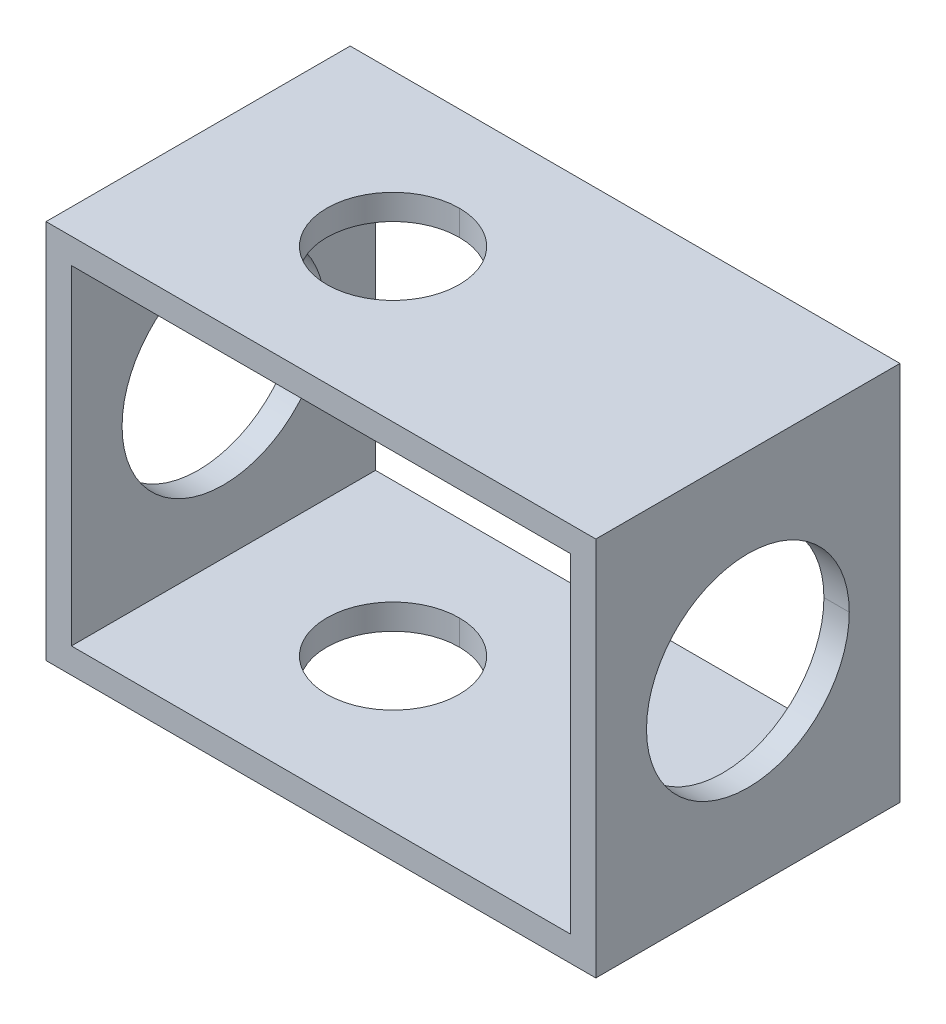
ISO-10303-21;
HEADER;
FILE_DESCRIPTION(('STEP AP214'),'2;1');
FILE_NAME('part.step','',(''),(''),'','','');
FILE_SCHEMA(('AUTOMOTIVE_DESIGN { 1 0 10303 214 1 1 1 1 }'));
ENDSEC;
DATA;
#1=APPLICATION_CONTEXT('core data for automotive mechanical design processes');
#2=APPLICATION_PROTOCOL_DEFINITION('international standard','automotive_design',2000,#1);
#3=PRODUCT_CONTEXT('',#1,'mechanical');
#4=PRODUCT('Part','Part','',(#3));
#5=PRODUCT_RELATED_PRODUCT_CATEGORY('part','',(#4));
#6=PRODUCT_DEFINITION_FORMATION('','',#4);
#7=PRODUCT_DEFINITION_CONTEXT('part definition',#1,'design');
#8=PRODUCT_DEFINITION('design','',#6,#7);
#9=PRODUCT_DEFINITION_SHAPE('','',#8);
#10=(LENGTH_UNIT() NAMED_UNIT(*) SI_UNIT(.MILLI.,.METRE.));
#11=(NAMED_UNIT(*) PLANE_ANGLE_UNIT() SI_UNIT($,.RADIAN.));
#12=(NAMED_UNIT(*) SI_UNIT($,.STERADIAN.) SOLID_ANGLE_UNIT());
#13=UNCERTAINTY_MEASURE_WITH_UNIT(LENGTH_MEASURE(1.E-05),#10,'distance_accuracy_value','');
#14=(GEOMETRIC_REPRESENTATION_CONTEXT(3) GLOBAL_UNCERTAINTY_ASSIGNED_CONTEXT((#13)) GLOBAL_UNIT_ASSIGNED_CONTEXT((#10,
#11,#12)) REPRESENTATION_CONTEXT('',''));
#15=CARTESIAN_POINT('',(0.,0.,0.));
#16=DIRECTION('',(0.,0.,1.));
#17=DIRECTION('',(1.,0.,0.));
#18=AXIS2_PLACEMENT_3D('',#15,#16,#17);
#19=CARTESIAN_POINT('',(-7.88522012578619,-18.75,15.));
#20=DIRECTION('',(0.,1.,0.));
#21=DIRECTION('',(0.,0.,1.));
#22=AXIS2_PLACEMENT_3D('',#19,#20,#21);
#23=CYLINDRICAL_SURFACE('',#22,6.53373114906941);
#24=CARTESIAN_POINT('',(-7.88522012578619,16.25,15.));
#25=DIRECTION('',(0.,-1.,0.));
#26=DIRECTION('',(0.,0.,-1.));
#27=AXIS2_PLACEMENT_3D('',#24,#25,#26);
#28=CIRCLE('',#27,6.53373114906941);
#29=CARTESIAN_POINT('',(-7.88522012578619,16.25,21.5337311490694));
#30=VERTEX_POINT('',#29);
#31=CARTESIAN_POINT('',(-7.88522012578619,16.25,8.46626885093059));
#32=VERTEX_POINT('',#31);
#33=EDGE_CURVE('E11',#30,#32,#28,.T.);
#34=ORIENTED_EDGE('',*,*,#33,.T.);
#35=DIRECTION('',(0.,1.,0.));
#36=VECTOR('',#35,1.);
#37=CARTESIAN_POINT('',(-7.88522012578619,-18.75,8.46626885093059));
#38=LINE('',#37,#36);
#39=CARTESIAN_POINT('',(-7.88522012578619,18.75,8.46626885093059));
#40=VERTEX_POINT('',#39);
#41=EDGE_CURVE('E27',#32,#40,#38,.T.);
#42=ORIENTED_EDGE('',*,*,#41,.T.);
#43=CARTESIAN_POINT('',(-7.88522012578619,18.75,15.));
#44=DIRECTION('',(0.,1.,0.));
#45=DIRECTION('',(0.,0.,1.));
#46=AXIS2_PLACEMENT_3D('',#43,#44,#45);
#47=CIRCLE('',#46,6.53373114906941);
#48=CARTESIAN_POINT('',(-7.88522012578619,18.75,21.5337311490694));
#49=VERTEX_POINT('',#48);
#50=EDGE_CURVE('E293',#40,#49,#47,.T.);
#51=ORIENTED_EDGE('',*,*,#50,.T.);
#52=DIRECTION('',(0.,1.,0.));
#53=VECTOR('',#52,1.);
#54=CARTESIAN_POINT('',(-7.88522012578619,-18.75,21.5337311490694));
#55=LINE('',#54,#53);
#56=EDGE_CURVE('E251',#30,#49,#55,.T.);
#57=ORIENTED_EDGE('',*,*,#56,.F.);
#58=EDGE_LOOP('',(#34,#42,#51,#57));
#59=FACE_BOUND('',#58,.T.);
#60=ADVANCED_FACE('F16',(#59),#23,.F.);
#61=CARTESIAN_POINT('',(-7.88522012578619,-18.75,15.));
#62=DIRECTION('',(0.,1.,0.));
#63=DIRECTION('',(0.,0.,1.));
#64=AXIS2_PLACEMENT_3D('',#61,#62,#63);
#65=CYLINDRICAL_SURFACE('',#64,6.53373114906941);
#66=CARTESIAN_POINT('',(-7.88522012578619,-18.75,15.));
#67=DIRECTION('',(0.,1.,0.));
#68=DIRECTION('',(0.,0.,1.));
#69=AXIS2_PLACEMENT_3D('',#66,#67,#68);
#70=CIRCLE('',#69,6.53373114906941);
#71=CARTESIAN_POINT('',(-7.88522012578619,-18.75,8.46626885093059));
#72=VERTEX_POINT('',#71);
#73=CARTESIAN_POINT('',(-7.88522012578619,-18.75,21.5337311490694));
#74=VERTEX_POINT('',#73);
#75=EDGE_CURVE('E150',#72,#74,#70,.T.);
#76=ORIENTED_EDGE('',*,*,#75,.F.);
#77=DIRECTION('',(0.,1.,0.));
#78=VECTOR('',#77,1.);
#79=CARTESIAN_POINT('',(-7.88522012578619,-18.75,8.46626885093059));
#80=LINE('',#79,#78);
#81=CARTESIAN_POINT('',(-7.88522012578619,-16.25,8.46626885093059));
#82=VERTEX_POINT('',#81);
#83=EDGE_CURVE('E168',#72,#82,#80,.T.);
#84=ORIENTED_EDGE('',*,*,#83,.T.);
#85=CARTESIAN_POINT('',(-7.88522012578619,-16.25,15.));
#86=DIRECTION('',(0.,1.,0.));
#87=DIRECTION('',(0.,0.,1.));
#88=AXIS2_PLACEMENT_3D('',#85,#86,#87);
#89=CIRCLE('',#88,6.53373114906941);
#90=CARTESIAN_POINT('',(-7.88522012578619,-16.25,21.5337311490694));
#91=VERTEX_POINT('',#90);
#92=EDGE_CURVE('E152',#82,#91,#89,.T.);
#93=ORIENTED_EDGE('',*,*,#92,.T.);
#94=DIRECTION('',(0.,1.,0.));
#95=VECTOR('',#94,1.);
#96=CARTESIAN_POINT('',(-7.88522012578619,-18.75,21.5337311490694));
#97=LINE('',#96,#95);
#98=EDGE_CURVE('E146',#74,#91,#97,.T.);
#99=ORIENTED_EDGE('',*,*,#98,.F.);
#100=EDGE_LOOP('',(#76,#84,#93,#99));
#101=FACE_BOUND('',#100,.T.);
#102=ADVANCED_FACE('F148',(#101),#65,.F.);
#103=CARTESIAN_POINT('',(27.1147798742138,0.,15.));
#104=DIRECTION('',(-1.,0.,0.));
#105=DIRECTION('',(0.,0.,1.));
#106=AXIS2_PLACEMENT_3D('',#103,#104,#105);
#107=CYLINDRICAL_SURFACE('',#106,10.);
#108=CARTESIAN_POINT('',(27.1147798742138,0.,15.));
#109=DIRECTION('',(-1.,0.,0.));
#110=DIRECTION('',(0.,0.,1.));
#111=AXIS2_PLACEMENT_3D('',#108,#109,#110);
#112=CIRCLE('',#111,10.);
#113=CARTESIAN_POINT('',(27.1147798742138,0.,5.));
#114=VERTEX_POINT('',#113);
#115=CARTESIAN_POINT('',(27.1147798742138,0.,25.));
#116=VERTEX_POINT('',#115);
#117=EDGE_CURVE('E202',#114,#116,#112,.T.);
#118=ORIENTED_EDGE('',*,*,#117,.F.);
#119=DIRECTION('',(-1.,0.,0.));
#120=VECTOR('',#119,1.);
#121=CARTESIAN_POINT('',(27.1147798742138,0.,5.));
#122=LINE('',#121,#120);
#123=CARTESIAN_POINT('',(24.6147798742138,0.,5.));
#124=VERTEX_POINT('',#123);
#125=EDGE_CURVE('E196',#114,#124,#122,.T.);
#126=ORIENTED_EDGE('',*,*,#125,.T.);
#127=CARTESIAN_POINT('',(24.6147798742138,0.,15.));
#128=DIRECTION('',(-1.,0.,0.));
#129=DIRECTION('',(0.,0.,1.));
#130=AXIS2_PLACEMENT_3D('',#127,#128,#129);
#131=CIRCLE('',#130,10.);
#132=CARTESIAN_POINT('',(24.6147798742138,0.,25.));
#133=VERTEX_POINT('',#132);
#134=EDGE_CURVE('E187',#124,#133,#131,.T.);
#135=ORIENTED_EDGE('',*,*,#134,.T.);
#136=DIRECTION('',(-1.,0.,0.));
#137=VECTOR('',#136,1.);
#138=CARTESIAN_POINT('',(27.1147798742138,0.,25.));
#139=LINE('',#138,#137);
#140=EDGE_CURVE('E20',#116,#133,#139,.T.);
#141=ORIENTED_EDGE('',*,*,#140,.F.);
#142=EDGE_LOOP('',(#118,#126,#135,#141));
#143=FACE_BOUND('',#142,.T.);
#144=ADVANCED_FACE('F371',(#143),#107,.F.);
#145=CARTESIAN_POINT('',(27.1147798742138,0.,15.));
#146=DIRECTION('',(-1.,0.,0.));
#147=DIRECTION('',(0.,0.,1.));
#148=AXIS2_PLACEMENT_3D('',#145,#146,#147);
#149=CYLINDRICAL_SURFACE('',#148,10.);
#150=CARTESIAN_POINT('',(-24.6147798742138,0.,15.));
#151=DIRECTION('',(1.,0.,0.));
#152=DIRECTION('',(0.,0.,-1.));
#153=AXIS2_PLACEMENT_3D('',#150,#151,#152);
#154=CIRCLE('',#153,10.);
#155=CARTESIAN_POINT('',(-24.6147798742138,0.,25.));
#156=VERTEX_POINT('',#155);
#157=CARTESIAN_POINT('',(-24.6147798742138,0.,5.));
#158=VERTEX_POINT('',#157);
#159=EDGE_CURVE('E184',#156,#158,#154,.T.);
#160=ORIENTED_EDGE('',*,*,#159,.T.);
#161=DIRECTION('',(-1.,0.,0.));
#162=VECTOR('',#161,1.);
#163=CARTESIAN_POINT('',(27.1147798742138,0.,5.));
#164=LINE('',#163,#162);
#165=CARTESIAN_POINT('',(-27.1147798742138,0.,5.));
#166=VERTEX_POINT('',#165);
#167=EDGE_CURVE('E182',#158,#166,#164,.T.);
#168=ORIENTED_EDGE('',*,*,#167,.T.);
#169=CARTESIAN_POINT('',(-27.1147798742138,0.,15.));
#170=DIRECTION('',(-1.,0.,0.));
#171=DIRECTION('',(0.,0.,1.));
#172=AXIS2_PLACEMENT_3D('',#169,#170,#171);
#173=CIRCLE('',#172,10.);
#174=CARTESIAN_POINT('',(-27.1147798742138,0.,25.));
#175=VERTEX_POINT('',#174);
#176=EDGE_CURVE('E223',#166,#175,#173,.T.);
#177=ORIENTED_EDGE('',*,*,#176,.T.);
#178=DIRECTION('',(-1.,0.,0.));
#179=VECTOR('',#178,1.);
#180=CARTESIAN_POINT('',(27.1147798742138,0.,25.));
#181=LINE('',#180,#179);
#182=EDGE_CURVE('E215',#156,#175,#181,.T.);
#183=ORIENTED_EDGE('',*,*,#182,.F.);
#184=EDGE_LOOP('',(#160,#168,#177,#183));
#185=FACE_BOUND('',#184,.T.);
#186=ADVANCED_FACE('F377',(#185),#149,.F.);
#187=CARTESIAN_POINT('',(0.,0.,30.));
#188=DIRECTION('',(0.,0.,1.));
#189=DIRECTION('',(1.,0.,0.));
#190=AXIS2_PLACEMENT_3D('',#187,#188,#189);
#191=PLANE('',#190);
#192=DIRECTION('',(0.,1.,0.));
#193=VECTOR('',#192,1.);
#194=CARTESIAN_POINT('',(27.1147798742138,17.5,30.));
#195=LINE('',#194,#193);
#196=CARTESIAN_POINT('',(27.1147798742138,-18.75,30.));
#197=VERTEX_POINT('',#196);
#198=CARTESIAN_POINT('',(27.1147798742138,18.75,30.));
#199=VERTEX_POINT('',#198);
#200=EDGE_CURVE('E220',#197,#199,#195,.T.);
#201=ORIENTED_EDGE('',*,*,#200,.T.);
#202=DIRECTION('',(-1.,0.,0.));
#203=VECTOR('',#202,1.);
#204=CARTESIAN_POINT('',(-25.8647798742138,18.75,30.));
#205=LINE('',#204,#203);
#206=CARTESIAN_POINT('',(-27.1147798742138,18.75,30.));
#207=VERTEX_POINT('',#206);
#208=EDGE_CURVE('E224',#199,#207,#205,.T.);
#209=ORIENTED_EDGE('',*,*,#208,.T.);
#210=DIRECTION('',(0.,-1.,0.));
#211=VECTOR('',#210,1.);
#212=CARTESIAN_POINT('',(-27.1147798742138,17.5,30.));
#213=LINE('',#212,#211);
#214=CARTESIAN_POINT('',(-27.1147798742138,-18.75,30.));
#215=VERTEX_POINT('',#214);
#216=EDGE_CURVE('E239',#207,#215,#213,.T.);
#217=ORIENTED_EDGE('',*,*,#216,.T.);
#218=DIRECTION('',(1.,0.,0.));
#219=VECTOR('',#218,1.);
#220=CARTESIAN_POINT('',(-25.8647798742138,-18.75,30.));
#221=LINE('',#220,#219);
#222=EDGE_CURVE('E236',#215,#197,#221,.T.);
#223=ORIENTED_EDGE('',*,*,#222,.T.);
#224=EDGE_LOOP('',(#201,#209,#217,#223));
#225=FACE_BOUND('',#224,.T.);
#226=DIRECTION('',(-1.,0.,0.));
#227=VECTOR('',#226,1.);
#228=CARTESIAN_POINT('',(-25.8647798742138,16.25,30.));
#229=LINE('',#228,#227);
#230=CARTESIAN_POINT('',(24.6147798742138,16.25,30.));
#231=VERTEX_POINT('',#230);
#232=CARTESIAN_POINT('',(-24.6147798742138,16.25,30.));
#233=VERTEX_POINT('',#232);
#234=EDGE_CURVE('E245',#231,#233,#229,.T.);
#235=ORIENTED_EDGE('',*,*,#234,.F.);
#236=DIRECTION('',(0.,1.,0.));
#237=VECTOR('',#236,1.);
#238=CARTESIAN_POINT('',(24.6147798742138,17.5,30.));
#239=LINE('',#238,#237);
#240=CARTESIAN_POINT('',(24.6147798742138,-16.25,30.));
#241=VERTEX_POINT('',#240);
#242=EDGE_CURVE('E166',#241,#231,#239,.T.);
#243=ORIENTED_EDGE('',*,*,#242,.F.);
#244=DIRECTION('',(1.,0.,0.));
#245=VECTOR('',#244,1.);
#246=CARTESIAN_POINT('',(-25.8647798742138,-16.25,30.));
#247=LINE('',#246,#245);
#248=CARTESIAN_POINT('',(-24.6147798742138,-16.25,30.));
#249=VERTEX_POINT('',#248);
#250=EDGE_CURVE('E188',#249,#241,#247,.T.);
#251=ORIENTED_EDGE('',*,*,#250,.F.);
#252=DIRECTION('',(0.,-1.,0.));
#253=VECTOR('',#252,1.);
#254=CARTESIAN_POINT('',(-24.6147798742138,17.5,30.));
#255=LINE('',#254,#253);
#256=EDGE_CURVE('E226',#233,#249,#255,.T.);
#257=ORIENTED_EDGE('',*,*,#256,.F.);
#258=EDGE_LOOP('',(#235,#243,#251,#257));
#259=FACE_BOUND('',#258,.T.);
#260=ADVANCED_FACE('F374',(#225,#259),#191,.T.);
#261=CARTESIAN_POINT('',(0.,0.,0.));
#262=DIRECTION('',(0.,0.,1.));
#263=DIRECTION('',(1.,0.,0.));
#264=AXIS2_PLACEMENT_3D('',#261,#262,#263);
#265=PLANE('',#264);
#266=DIRECTION('',(0.,1.,0.));
#267=VECTOR('',#266,1.);
#268=CARTESIAN_POINT('',(27.1147798742138,17.5,0.));
#269=LINE('',#268,#267);
#270=CARTESIAN_POINT('',(27.1147798742138,-18.75,0.));
#271=VERTEX_POINT('',#270);
#272=CARTESIAN_POINT('',(27.1147798742138,18.75,0.));
#273=VERTEX_POINT('',#272);
#274=EDGE_CURVE('E235',#271,#273,#269,.T.);
#275=ORIENTED_EDGE('',*,*,#274,.F.);
#276=DIRECTION('',(1.,0.,0.));
#277=VECTOR('',#276,1.);
#278=CARTESIAN_POINT('',(-25.8647798742138,-18.75,0.));
#279=LINE('',#278,#277);
#280=CARTESIAN_POINT('',(-27.1147798742138,-18.75,0.));
#281=VERTEX_POINT('',#280);
#282=EDGE_CURVE('E178',#281,#271,#279,.T.);
#283=ORIENTED_EDGE('',*,*,#282,.F.);
#284=DIRECTION('',(0.,-1.,0.));
#285=VECTOR('',#284,1.);
#286=CARTESIAN_POINT('',(-27.1147798742138,17.5,0.));
#287=LINE('',#286,#285);
#288=CARTESIAN_POINT('',(-27.1147798742138,18.75,0.));
#289=VERTEX_POINT('',#288);
#290=EDGE_CURVE('E304',#289,#281,#287,.T.);
#291=ORIENTED_EDGE('',*,*,#290,.F.);
#292=DIRECTION('',(-1.,0.,0.));
#293=VECTOR('',#292,1.);
#294=CARTESIAN_POINT('',(-25.8647798742138,18.75,0.));
#295=LINE('',#294,#293);
#296=EDGE_CURVE('E212',#273,#289,#295,.T.);
#297=ORIENTED_EDGE('',*,*,#296,.F.);
#298=EDGE_LOOP('',(#275,#283,#291,#297));
#299=FACE_BOUND('',#298,.T.);
#300=DIRECTION('',(0.,1.,0.));
#301=VECTOR('',#300,1.);
#302=CARTESIAN_POINT('',(24.6147798742138,17.5,0.));
#303=LINE('',#302,#301);
#304=CARTESIAN_POINT('',(24.6147798742138,-16.25,0.));
#305=VERTEX_POINT('',#304);
#306=CARTESIAN_POINT('',(24.6147798742138,16.25,0.));
#307=VERTEX_POINT('',#306);
#308=EDGE_CURVE('E240',#305,#307,#303,.T.);
#309=ORIENTED_EDGE('',*,*,#308,.T.);
#310=DIRECTION('',(-1.,0.,0.));
#311=VECTOR('',#310,1.);
#312=CARTESIAN_POINT('',(-25.8647798742138,16.25,0.));
#313=LINE('',#312,#311);
#314=CARTESIAN_POINT('',(-24.6147798742138,16.25,0.));
#315=VERTEX_POINT('',#314);
#316=EDGE_CURVE('E279',#307,#315,#313,.T.);
#317=ORIENTED_EDGE('',*,*,#316,.T.);
#318=DIRECTION('',(0.,-1.,0.));
#319=VECTOR('',#318,1.);
#320=CARTESIAN_POINT('',(-24.6147798742138,17.5,0.));
#321=LINE('',#320,#319);
#322=CARTESIAN_POINT('',(-24.6147798742138,-16.25,0.));
#323=VERTEX_POINT('',#322);
#324=EDGE_CURVE('E234',#315,#323,#321,.T.);
#325=ORIENTED_EDGE('',*,*,#324,.T.);
#326=DIRECTION('',(1.,0.,0.));
#327=VECTOR('',#326,1.);
#328=CARTESIAN_POINT('',(-25.8647798742138,-16.25,0.));
#329=LINE('',#328,#327);
#330=EDGE_CURVE('E231',#323,#305,#329,.T.);
#331=ORIENTED_EDGE('',*,*,#330,.T.);
#332=EDGE_LOOP('',(#309,#317,#325,#331));
#333=FACE_BOUND('',#332,.T.);
#334=ADVANCED_FACE('F278',(#299,#333),#265,.F.);
#335=CARTESIAN_POINT('',(27.1147798742138,17.5,30.));
#336=DIRECTION('',(-1.,0.,0.));
#337=DIRECTION('',(0.,0.,1.));
#338=AXIS2_PLACEMENT_3D('',#335,#336,#337);
#339=PLANE('',#338);
#340=ORIENTED_EDGE('',*,*,#274,.T.);
#341=DIRECTION('',(0.,0.,-1.));
#342=VECTOR('',#341,1.);
#343=CARTESIAN_POINT('',(27.1147798742138,18.75,30.));
#344=LINE('',#343,#342);
#345=EDGE_CURVE('E301',#199,#273,#344,.T.);
#346=ORIENTED_EDGE('',*,*,#345,.F.);
#347=ORIENTED_EDGE('',*,*,#200,.F.);
#348=DIRECTION('',(0.,0.,-1.));
#349=VECTOR('',#348,1.);
#350=CARTESIAN_POINT('',(27.1147798742138,-18.75,30.));
#351=LINE('',#350,#349);
#352=EDGE_CURVE('E201',#197,#271,#351,.T.);
#353=ORIENTED_EDGE('',*,*,#352,.T.);
#354=EDGE_LOOP('',(#340,#346,#347,#353));
#355=FACE_BOUND('',#354,.T.);
#356=CARTESIAN_POINT('',(27.1147798742138,0.,15.));
#357=DIRECTION('',(-1.,0.,0.));
#358=DIRECTION('',(0.,0.,1.));
#359=AXIS2_PLACEMENT_3D('',#356,#357,#358);
#360=CIRCLE('',#359,10.);
#361=EDGE_CURVE('E197',#116,#114,#360,.T.);
#362=ORIENTED_EDGE('',*,*,#361,.T.);
#363=ORIENTED_EDGE('',*,*,#117,.T.);
#364=EDGE_LOOP('',(#362,#363));
#365=FACE_BOUND('',#364,.T.);
#366=ADVANCED_FACE('F355',(#355,#365),#339,.F.);
#367=CARTESIAN_POINT('',(-25.8647798742138,18.75,30.));
#368=DIRECTION('',(0.,-1.,0.));
#369=DIRECTION('',(0.,0.,-1.));
#370=AXIS2_PLACEMENT_3D('',#367,#368,#369);
#371=PLANE('',#370);
#372=ORIENTED_EDGE('',*,*,#296,.T.);
#373=DIRECTION('',(0.,0.,-1.));
#374=VECTOR('',#373,1.);
#375=CARTESIAN_POINT('',(-27.1147798742138,18.75,30.));
#376=LINE('',#375,#374);
#377=EDGE_CURVE('E205',#207,#289,#376,.T.);
#378=ORIENTED_EDGE('',*,*,#377,.F.);
#379=ORIENTED_EDGE('',*,*,#208,.F.);
#380=ORIENTED_EDGE('',*,*,#345,.T.);
#381=EDGE_LOOP('',(#372,#378,#379,#380));
#382=FACE_BOUND('',#381,.T.);
#383=CARTESIAN_POINT('',(-7.88522012578619,18.75,15.));
#384=DIRECTION('',(0.,1.,0.));
#385=DIRECTION('',(0.,0.,1.));
#386=AXIS2_PLACEMENT_3D('',#383,#384,#385);
#387=CIRCLE('',#386,6.53373114906941);
#388=EDGE_CURVE('E249',#49,#40,#387,.T.);
#389=ORIENTED_EDGE('',*,*,#388,.F.);
#390=ORIENTED_EDGE('',*,*,#50,.F.);
#391=EDGE_LOOP('',(#389,#390));
#392=FACE_BOUND('',#391,.T.);
#393=ADVANCED_FACE('F353',(#382,#392),#371,.F.);
#394=CARTESIAN_POINT('',(-27.1147798742138,17.5,30.));
#395=DIRECTION('',(1.,0.,0.));
#396=DIRECTION('',(0.,1.,0.));
#397=AXIS2_PLACEMENT_3D('',#394,#395,#396);
#398=PLANE('',#397);
#399=ORIENTED_EDGE('',*,*,#290,.T.);
#400=DIRECTION('',(0.,0.,-1.));
#401=VECTOR('',#400,1.);
#402=CARTESIAN_POINT('',(-27.1147798742138,-18.75,30.));
#403=LINE('',#402,#401);
#404=EDGE_CURVE('E170',#215,#281,#403,.T.);
#405=ORIENTED_EDGE('',*,*,#404,.F.);
#406=ORIENTED_EDGE('',*,*,#216,.F.);
#407=ORIENTED_EDGE('',*,*,#377,.T.);
#408=EDGE_LOOP('',(#399,#405,#406,#407));
#409=FACE_BOUND('',#408,.T.);
#410=CARTESIAN_POINT('',(-27.1147798742138,0.,15.));
#411=DIRECTION('',(-1.,0.,0.));
#412=DIRECTION('',(0.,0.,1.));
#413=AXIS2_PLACEMENT_3D('',#410,#411,#412);
#414=CIRCLE('',#413,10.);
#415=EDGE_CURVE('E219',#175,#166,#414,.T.);
#416=ORIENTED_EDGE('',*,*,#415,.F.);
#417=ORIENTED_EDGE('',*,*,#176,.F.);
#418=EDGE_LOOP('',(#416,#417));
#419=FACE_BOUND('',#418,.T.);
#420=ADVANCED_FACE('F18',(#409,#419),#398,.F.);
#421=CARTESIAN_POINT('',(-25.8647798742138,-18.75,30.));
#422=DIRECTION('',(0.,1.,0.));
#423=DIRECTION('',(1.,0.,0.));
#424=AXIS2_PLACEMENT_3D('',#421,#422,#423);
#425=PLANE('',#424);
#426=ORIENTED_EDGE('',*,*,#282,.T.);
#427=ORIENTED_EDGE('',*,*,#352,.F.);
#428=ORIENTED_EDGE('',*,*,#222,.F.);
#429=ORIENTED_EDGE('',*,*,#404,.T.);
#430=EDGE_LOOP('',(#426,#427,#428,#429));
#431=FACE_BOUND('',#430,.T.);
#432=CARTESIAN_POINT('',(-7.88522012578619,-18.75,15.));
#433=DIRECTION('',(0.,1.,0.));
#434=DIRECTION('',(0.,0.,1.));
#435=AXIS2_PLACEMENT_3D('',#432,#433,#434);
#436=CIRCLE('',#435,6.53373114906941);
#437=EDGE_CURVE('E164',#74,#72,#436,.T.);
#438=ORIENTED_EDGE('',*,*,#437,.T.);
#439=ORIENTED_EDGE('',*,*,#75,.T.);
#440=EDGE_LOOP('',(#438,#439));
#441=FACE_BOUND('',#440,.T.);
#442=ADVANCED_FACE('F163',(#431,#441),#425,.F.);
#443=CARTESIAN_POINT('',(24.6147798742138,17.5,30.));
#444=DIRECTION('',(-1.,0.,0.));
#445=DIRECTION('',(0.,0.,1.));
#446=AXIS2_PLACEMENT_3D('',#443,#444,#445);
#447=PLANE('',#446);
#448=ORIENTED_EDGE('',*,*,#308,.F.);
#449=DIRECTION('',(0.,0.,-1.));
#450=VECTOR('',#449,1.);
#451=CARTESIAN_POINT('',(24.6147798742138,-16.25,30.));
#452=LINE('',#451,#450);
#453=EDGE_CURVE('E192',#241,#305,#452,.T.);
#454=ORIENTED_EDGE('',*,*,#453,.F.);
#455=ORIENTED_EDGE('',*,*,#242,.T.);
#456=DIRECTION('',(0.,0.,-1.));
#457=VECTOR('',#456,1.);
#458=CARTESIAN_POINT('',(24.6147798742138,16.25,30.));
#459=LINE('',#458,#457);
#460=EDGE_CURVE('E244',#231,#307,#459,.T.);
#461=ORIENTED_EDGE('',*,*,#460,.T.);
#462=EDGE_LOOP('',(#448,#454,#455,#461));
#463=FACE_BOUND('',#462,.T.);
#464=CARTESIAN_POINT('',(24.6147798742138,0.,15.));
#465=DIRECTION('',(-1.,0.,0.));
#466=DIRECTION('',(0.,0.,1.));
#467=AXIS2_PLACEMENT_3D('',#464,#465,#466);
#468=CIRCLE('',#467,10.);
#469=EDGE_CURVE('E158',#133,#124,#468,.T.);
#470=ORIENTED_EDGE('',*,*,#469,.F.);
#471=ORIENTED_EDGE('',*,*,#134,.F.);
#472=EDGE_LOOP('',(#470,#471));
#473=FACE_BOUND('',#472,.T.);
#474=ADVANCED_FACE('F533',(#463,#473),#447,.T.);
#475=CARTESIAN_POINT('',(-25.8647798742138,16.25,30.));
#476=DIRECTION('',(0.,-1.,0.));
#477=DIRECTION('',(0.,0.,-1.));
#478=AXIS2_PLACEMENT_3D('',#475,#476,#477);
#479=PLANE('',#478);
#480=ORIENTED_EDGE('',*,*,#316,.F.);
#481=ORIENTED_EDGE('',*,*,#460,.F.);
#482=ORIENTED_EDGE('',*,*,#234,.T.);
#483=DIRECTION('',(0.,0.,-1.));
#484=VECTOR('',#483,1.);
#485=CARTESIAN_POINT('',(-24.6147798742138,16.25,30.));
#486=LINE('',#485,#484);
#487=EDGE_CURVE('E230',#233,#315,#486,.T.);
#488=ORIENTED_EDGE('',*,*,#487,.T.);
#489=EDGE_LOOP('',(#480,#481,#482,#488));
#490=FACE_BOUND('',#489,.T.);
#491=ORIENTED_EDGE('',*,*,#33,.F.);
#492=CARTESIAN_POINT('',(-7.88522012578619,16.25,15.));
#493=DIRECTION('',(0.,-1.,0.));
#494=DIRECTION('',(0.,0.,-1.));
#495=AXIS2_PLACEMENT_3D('',#492,#493,#494);
#496=CIRCLE('',#495,6.53373114906941);
#497=EDGE_CURVE('E296',#32,#30,#496,.T.);
#498=ORIENTED_EDGE('',*,*,#497,.F.);
#499=EDGE_LOOP('',(#491,#498));
#500=FACE_BOUND('',#499,.T.);
#501=ADVANCED_FACE('F349',(#490,#500),#479,.T.);
#502=CARTESIAN_POINT('',(-24.6147798742138,17.5,30.));
#503=DIRECTION('',(1.,0.,0.));
#504=DIRECTION('',(0.,1.,0.));
#505=AXIS2_PLACEMENT_3D('',#502,#503,#504);
#506=PLANE('',#505);
#507=ORIENTED_EDGE('',*,*,#324,.F.);
#508=ORIENTED_EDGE('',*,*,#487,.F.);
#509=ORIENTED_EDGE('',*,*,#256,.T.);
#510=DIRECTION('',(0.,0.,-1.));
#511=VECTOR('',#510,1.);
#512=CARTESIAN_POINT('',(-24.6147798742138,-16.25,30.));
#513=LINE('',#512,#511);
#514=EDGE_CURVE('E191',#249,#323,#513,.T.);
#515=ORIENTED_EDGE('',*,*,#514,.T.);
#516=EDGE_LOOP('',(#507,#508,#509,#515));
#517=FACE_BOUND('',#516,.T.);
#518=ORIENTED_EDGE('',*,*,#159,.F.);
#519=CARTESIAN_POINT('',(-24.6147798742138,0.,15.));
#520=DIRECTION('',(1.,0.,0.));
#521=DIRECTION('',(0.,0.,-1.));
#522=AXIS2_PLACEMENT_3D('',#519,#520,#521);
#523=CIRCLE('',#522,10.);
#524=EDGE_CURVE('E218',#158,#156,#523,.T.);
#525=ORIENTED_EDGE('',*,*,#524,.F.);
#526=EDGE_LOOP('',(#518,#525));
#527=FACE_BOUND('',#526,.T.);
#528=ADVANCED_FACE('F265',(#517,#527),#506,.T.);
#529=CARTESIAN_POINT('',(-25.8647798742138,-16.25,30.));
#530=DIRECTION('',(0.,1.,0.));
#531=DIRECTION('',(1.,0.,0.));
#532=AXIS2_PLACEMENT_3D('',#529,#530,#531);
#533=PLANE('',#532);
#534=ORIENTED_EDGE('',*,*,#330,.F.);
#535=ORIENTED_EDGE('',*,*,#514,.F.);
#536=ORIENTED_EDGE('',*,*,#250,.T.);
#537=ORIENTED_EDGE('',*,*,#453,.T.);
#538=EDGE_LOOP('',(#534,#535,#536,#537));
#539=FACE_BOUND('',#538,.T.);
#540=CARTESIAN_POINT('',(-7.88522012578619,-16.25,15.));
#541=DIRECTION('',(0.,1.,0.));
#542=DIRECTION('',(0.,0.,1.));
#543=AXIS2_PLACEMENT_3D('',#540,#541,#542);
#544=CIRCLE('',#543,6.53373114906941);
#545=EDGE_CURVE('E159',#91,#82,#544,.T.);
#546=ORIENTED_EDGE('',*,*,#545,.F.);
#547=ORIENTED_EDGE('',*,*,#92,.F.);
#548=EDGE_LOOP('',(#546,#547));
#549=FACE_BOUND('',#548,.T.);
#550=ADVANCED_FACE('F271',(#539,#549),#533,.T.);
#551=CARTESIAN_POINT('',(27.1147798742138,0.,15.));
#552=DIRECTION('',(-1.,0.,0.));
#553=DIRECTION('',(0.,0.,1.));
#554=AXIS2_PLACEMENT_3D('',#551,#552,#553);
#555=CYLINDRICAL_SURFACE('',#554,10.);
#556=ORIENTED_EDGE('',*,*,#167,.F.);
#557=ORIENTED_EDGE('',*,*,#524,.T.);
#558=ORIENTED_EDGE('',*,*,#182,.T.);
#559=ORIENTED_EDGE('',*,*,#415,.T.);
#560=EDGE_LOOP('',(#556,#557,#558,#559));
#561=FACE_BOUND('',#560,.T.);
#562=ADVANCED_FACE('F386',(#561),#555,.F.);
#563=CARTESIAN_POINT('',(27.1147798742138,0.,15.));
#564=DIRECTION('',(-1.,0.,0.));
#565=DIRECTION('',(0.,0.,1.));
#566=AXIS2_PLACEMENT_3D('',#563,#564,#565);
#567=CYLINDRICAL_SURFACE('',#566,10.);
#568=ORIENTED_EDGE('',*,*,#125,.F.);
#569=ORIENTED_EDGE('',*,*,#361,.F.);
#570=ORIENTED_EDGE('',*,*,#140,.T.);
#571=ORIENTED_EDGE('',*,*,#469,.T.);
#572=EDGE_LOOP('',(#568,#569,#570,#571));
#573=FACE_BOUND('',#572,.T.);
#574=ADVANCED_FACE('F384',(#573),#567,.F.);
#575=CARTESIAN_POINT('',(-7.88522012578619,-18.75,15.));
#576=DIRECTION('',(0.,1.,0.));
#577=DIRECTION('',(0.,0.,1.));
#578=AXIS2_PLACEMENT_3D('',#575,#576,#577);
#579=CYLINDRICAL_SURFACE('',#578,6.53373114906941);
#580=ORIENTED_EDGE('',*,*,#83,.F.);
#581=ORIENTED_EDGE('',*,*,#437,.F.);
#582=ORIENTED_EDGE('',*,*,#98,.T.);
#583=ORIENTED_EDGE('',*,*,#545,.T.);
#584=EDGE_LOOP('',(#580,#581,#582,#583));
#585=FACE_BOUND('',#584,.T.);
#586=ADVANCED_FACE('F167',(#585),#579,.F.);
#587=CARTESIAN_POINT('',(-7.88522012578619,-18.75,15.));
#588=DIRECTION('',(0.,1.,0.));
#589=DIRECTION('',(0.,0.,1.));
#590=AXIS2_PLACEMENT_3D('',#587,#588,#589);
#591=CYLINDRICAL_SURFACE('',#590,6.53373114906941);
#592=ORIENTED_EDGE('',*,*,#41,.F.);
#593=ORIENTED_EDGE('',*,*,#497,.T.);
#594=ORIENTED_EDGE('',*,*,#56,.T.);
#595=ORIENTED_EDGE('',*,*,#388,.T.);
#596=EDGE_LOOP('',(#592,#593,#594,#595));
#597=FACE_BOUND('',#596,.T.);
#598=ADVANCED_FACE('F343',(#597),#591,.F.);
#599=CLOSED_SHELL('',(#60,#102,#144,#186,#260,#334,#366,#393,#420,#442,#474,#501,#528,#550,#562,
#574,#586,#598));
#600=MANIFOLD_SOLID_BREP('B1',#599);
#601=ADVANCED_BREP_SHAPE_REPRESENTATION('',(#18,#600),#14);
#602=SHAPE_DEFINITION_REPRESENTATION(#9,#601);
ENDSEC;
END-ISO-10303-21;
